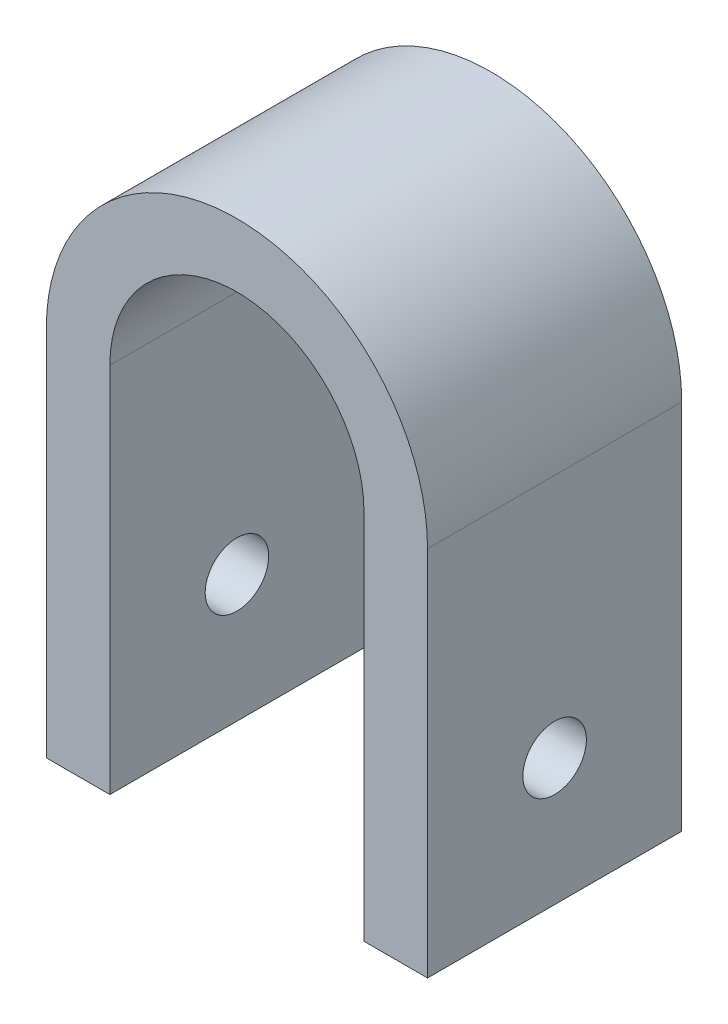
ISO-10303-21;
HEADER;
FILE_DESCRIPTION(('STEP AP214'),'2;1');
FILE_NAME('part.step','',(''),(''),'','','');
FILE_SCHEMA(('AUTOMOTIVE_DESIGN { 1 0 10303 214 1 1 1 1 }'));
ENDSEC;
DATA;
#1=APPLICATION_CONTEXT('core data for automotive mechanical design processes');
#2=APPLICATION_PROTOCOL_DEFINITION('international standard','automotive_design',2000,#1);
#3=PRODUCT_CONTEXT('',#1,'mechanical');
#4=PRODUCT('Part','Part','',(#3));
#5=PRODUCT_RELATED_PRODUCT_CATEGORY('part','',(#4));
#6=PRODUCT_DEFINITION_FORMATION('','',#4);
#7=PRODUCT_DEFINITION_CONTEXT('part definition',#1,'design');
#8=PRODUCT_DEFINITION('design','',#6,#7);
#9=PRODUCT_DEFINITION_SHAPE('','',#8);
#10=(LENGTH_UNIT() NAMED_UNIT(*) SI_UNIT(.MILLI.,.METRE.));
#11=(NAMED_UNIT(*) PLANE_ANGLE_UNIT() SI_UNIT($,.RADIAN.));
#12=(NAMED_UNIT(*) SI_UNIT($,.STERADIAN.) SOLID_ANGLE_UNIT());
#13=UNCERTAINTY_MEASURE_WITH_UNIT(LENGTH_MEASURE(1.E-05),#10,'distance_accuracy_value','');
#14=(GEOMETRIC_REPRESENTATION_CONTEXT(3) GLOBAL_UNCERTAINTY_ASSIGNED_CONTEXT((#13)) GLOBAL_UNIT_ASSIGNED_CONTEXT((#10,
#11,#12)) REPRESENTATION_CONTEXT('',''));
#15=CARTESIAN_POINT('',(0.,0.,0.));
#16=DIRECTION('',(0.,0.,1.));
#17=DIRECTION('',(1.,0.,0.));
#18=AXIS2_PLACEMENT_3D('',#15,#16,#17);
#19=CARTESIAN_POINT('',(0.,0.,8.));
#20=DIRECTION('',(0.,0.,-1.));
#21=DIRECTION('',(-1.,0.,0.));
#22=AXIS2_PLACEMENT_3D('',#19,#20,#21);
#23=CYLINDRICAL_SURFACE('',#22,4.);
#24=CARTESIAN_POINT('',(0.,0.,0.));
#25=DIRECTION('',(0.,0.,-1.));
#26=DIRECTION('',(1.,0.,0.));
#27=AXIS2_PLACEMENT_3D('',#24,#25,#26);
#28=CIRCLE('',#27,4.);
#29=CARTESIAN_POINT('',(-4.,0.,0.));
#30=VERTEX_POINT('',#29);
#31=CARTESIAN_POINT('',(4.,0.,0.));
#32=VERTEX_POINT('',#31);
#33=EDGE_CURVE('E142',#30,#32,#28,.T.);
#34=ORIENTED_EDGE('',*,*,#33,.T.);
#35=DIRECTION('',(0.,0.,-1.));
#36=VECTOR('',#35,1.);
#37=CARTESIAN_POINT('',(4.,0.,8.));
#38=LINE('',#37,#36);
#39=CARTESIAN_POINT('',(4.,0.,8.));
#40=VERTEX_POINT('',#39);
#41=EDGE_CURVE('E13',#40,#32,#38,.T.);
#42=ORIENTED_EDGE('',*,*,#41,.F.);
#43=CARTESIAN_POINT('',(0.,0.,8.));
#44=DIRECTION('',(0.,0.,-1.));
#45=DIRECTION('',(1.,0.,0.));
#46=AXIS2_PLACEMENT_3D('',#43,#44,#45);
#47=CIRCLE('',#46,4.);
#48=CARTESIAN_POINT('',(-4.,0.,8.));
#49=VERTEX_POINT('',#48);
#50=EDGE_CURVE('E157',#49,#40,#47,.T.);
#51=ORIENTED_EDGE('',*,*,#50,.F.);
#52=DIRECTION('',(0.,0.,-1.));
#53=VECTOR('',#52,1.);
#54=CARTESIAN_POINT('',(-4.,0.,8.));
#55=LINE('',#54,#53);
#56=EDGE_CURVE('E138',#49,#30,#55,.T.);
#57=ORIENTED_EDGE('',*,*,#56,.T.);
#58=EDGE_LOOP('',(#34,#42,#51,#57));
#59=FACE_BOUND('',#58,.T.);
#60=ADVANCED_FACE('F45',(#59),#23,.F.);
#61=CARTESIAN_POINT('',(4.,0.,8.));
#62=DIRECTION('',(1.,-5.94859942086409E-11,0.));
#63=DIRECTION('',(5.94859942086409E-11,1.,0.));
#64=AXIS2_PLACEMENT_3D('',#61,#62,#63);
#65=PLANE('',#64);
#66=CARTESIAN_POINT('',(3.99999999954187,-7.7015254759383,4.));
#67=DIRECTION('',(1.,-5.94859942086409E-11,0.));
#68=DIRECTION('',(5.94859942086409E-11,1.,0.));
#69=AXIS2_PLACEMENT_3D('',#66,#67,#68);
#70=CIRCLE('',#69,1.);
#71=CARTESIAN_POINT('',(3.99999999954187,-7.7015254759383,5.));
#72=VERTEX_POINT('',#71);
#73=EDGE_CURVE('E146',#72,#72,#70,.T.);
#74=ORIENTED_EDGE('',*,*,#73,.T.);
#75=EDGE_LOOP('',(#74));
#76=FACE_BOUND('',#75,.T.);
#77=DIRECTION('',(-5.94859942086409E-11,-1.,0.));
#78=VECTOR('',#77,1.);
#79=CARTESIAN_POINT('',(4.,0.,0.));
#80=LINE('',#79,#78);
#81=CARTESIAN_POINT('',(3.99999999930393,-11.7015254759383,0.));
#82=VERTEX_POINT('',#81);
#83=EDGE_CURVE('E145',#32,#82,#80,.T.);
#84=ORIENTED_EDGE('',*,*,#83,.T.);
#85=DIRECTION('',(0.,0.,-1.));
#86=VECTOR('',#85,1.);
#87=CARTESIAN_POINT('',(3.99999999930393,-11.7015254759383,8.));
#88=LINE('',#87,#86);
#89=CARTESIAN_POINT('',(3.99999999930393,-11.7015254759383,8.));
#90=VERTEX_POINT('',#89);
#91=EDGE_CURVE('E54',#90,#82,#88,.T.);
#92=ORIENTED_EDGE('',*,*,#91,.F.);
#93=DIRECTION('',(-5.94859942086409E-11,-1.,0.));
#94=VECTOR('',#93,1.);
#95=CARTESIAN_POINT('',(4.,0.,8.));
#96=LINE('',#95,#94);
#97=EDGE_CURVE('E105',#40,#90,#96,.T.);
#98=ORIENTED_EDGE('',*,*,#97,.F.);
#99=ORIENTED_EDGE('',*,*,#41,.T.);
#100=EDGE_LOOP('',(#84,#92,#98,#99));
#101=FACE_BOUND('',#100,.T.);
#102=ADVANCED_FACE('F218',(#76,#101),#65,.F.);
#103=CARTESIAN_POINT('',(6.,-11.7015254759383,8.));
#104=DIRECTION('',(0.,1.,0.));
#105=DIRECTION('',(0.,0.,1.));
#106=AXIS2_PLACEMENT_3D('',#103,#104,#105);
#107=PLANE('',#106);
#108=DIRECTION('',(1.,0.,0.));
#109=VECTOR('',#108,1.);
#110=CARTESIAN_POINT('',(6.,-11.7015254759383,0.));
#111=LINE('',#110,#109);
#112=CARTESIAN_POINT('',(6.,-11.7015254759383,0.));
#113=VERTEX_POINT('',#112);
#114=EDGE_CURVE('E148',#82,#113,#111,.T.);
#115=ORIENTED_EDGE('',*,*,#114,.T.);
#116=DIRECTION('',(0.,0.,-1.));
#117=VECTOR('',#116,1.);
#118=CARTESIAN_POINT('',(6.,-11.7015254759383,8.));
#119=LINE('',#118,#117);
#120=CARTESIAN_POINT('',(6.,-11.7015254759383,8.));
#121=VERTEX_POINT('',#120);
#122=EDGE_CURVE('E164',#121,#113,#119,.T.);
#123=ORIENTED_EDGE('',*,*,#122,.F.);
#124=DIRECTION('',(1.,0.,0.));
#125=VECTOR('',#124,1.);
#126=CARTESIAN_POINT('',(6.,-11.7015254759383,8.));
#127=LINE('',#126,#125);
#128=EDGE_CURVE('E173',#90,#121,#127,.T.);
#129=ORIENTED_EDGE('',*,*,#128,.F.);
#130=ORIENTED_EDGE('',*,*,#91,.T.);
#131=EDGE_LOOP('',(#115,#123,#129,#130));
#132=FACE_BOUND('',#131,.T.);
#133=ADVANCED_FACE('F171',(#132),#107,.F.);
#134=CARTESIAN_POINT('',(6.,0.,8.));
#135=DIRECTION('',(-1.,0.,0.));
#136=DIRECTION('',(0.,0.,1.));
#137=AXIS2_PLACEMENT_3D('',#134,#135,#136);
#138=PLANE('',#137);
#139=CARTESIAN_POINT('',(6.,-7.7015254759383,4.));
#140=DIRECTION('',(-1.,0.,0.));
#141=DIRECTION('',(0.,0.,1.));
#142=AXIS2_PLACEMENT_3D('',#139,#140,#141);
#143=CIRCLE('',#142,1.);
#144=CARTESIAN_POINT('',(6.,-7.7015254759383,5.));
#145=VERTEX_POINT('',#144);
#146=EDGE_CURVE('E196',#145,#145,#143,.T.);
#147=ORIENTED_EDGE('',*,*,#146,.T.);
#148=EDGE_LOOP('',(#147));
#149=FACE_BOUND('',#148,.T.);
#150=DIRECTION('',(0.,1.,0.));
#151=VECTOR('',#150,1.);
#152=CARTESIAN_POINT('',(6.,0.,0.));
#153=LINE('',#152,#151);
#154=CARTESIAN_POINT('',(6.,0.,0.));
#155=VERTEX_POINT('',#154);
#156=EDGE_CURVE('E150',#113,#155,#153,.T.);
#157=ORIENTED_EDGE('',*,*,#156,.T.);
#158=DIRECTION('',(0.,0.,-1.));
#159=VECTOR('',#158,1.);
#160=CARTESIAN_POINT('',(6.,0.,8.));
#161=LINE('',#160,#159);
#162=CARTESIAN_POINT('',(6.,0.,8.));
#163=VERTEX_POINT('',#162);
#164=EDGE_CURVE('E161',#163,#155,#161,.T.);
#165=ORIENTED_EDGE('',*,*,#164,.F.);
#166=DIRECTION('',(0.,1.,0.));
#167=VECTOR('',#166,1.);
#168=CARTESIAN_POINT('',(6.,0.,8.));
#169=LINE('',#168,#167);
#170=EDGE_CURVE('E185',#121,#163,#169,.T.);
#171=ORIENTED_EDGE('',*,*,#170,.F.);
#172=ORIENTED_EDGE('',*,*,#122,.T.);
#173=EDGE_LOOP('',(#157,#165,#171,#172));
#174=FACE_BOUND('',#173,.T.);
#175=ADVANCED_FACE('F181',(#149,#174),#138,.F.);
#176=CARTESIAN_POINT('',(0.,0.,8.));
#177=DIRECTION('',(0.,0.,-1.));
#178=DIRECTION('',(-1.,0.,0.));
#179=AXIS2_PLACEMENT_3D('',#176,#177,#178);
#180=CYLINDRICAL_SURFACE('',#179,6.);
#181=CARTESIAN_POINT('',(0.,0.,0.));
#182=DIRECTION('',(0.,0.,1.));
#183=DIRECTION('',(1.,0.,0.));
#184=AXIS2_PLACEMENT_3D('',#181,#182,#183);
#185=CIRCLE('',#184,6.);
#186=CARTESIAN_POINT('',(-6.,0.,0.));
#187=VERTEX_POINT('',#186);
#188=EDGE_CURVE('E152',#155,#187,#185,.T.);
#189=ORIENTED_EDGE('',*,*,#188,.T.);
#190=DIRECTION('',(0.,0.,-1.));
#191=VECTOR('',#190,1.);
#192=CARTESIAN_POINT('',(-6.,0.,8.));
#193=LINE('',#192,#191);
#194=CARTESIAN_POINT('',(-6.,0.,8.));
#195=VERTEX_POINT('',#194);
#196=EDGE_CURVE('E133',#195,#187,#193,.T.);
#197=ORIENTED_EDGE('',*,*,#196,.F.);
#198=CARTESIAN_POINT('',(0.,0.,8.));
#199=DIRECTION('',(0.,0.,1.));
#200=DIRECTION('',(1.,0.,0.));
#201=AXIS2_PLACEMENT_3D('',#198,#199,#200);
#202=CIRCLE('',#201,6.);
#203=EDGE_CURVE('E124',#163,#195,#202,.T.);
#204=ORIENTED_EDGE('',*,*,#203,.F.);
#205=ORIENTED_EDGE('',*,*,#164,.T.);
#206=EDGE_LOOP('',(#189,#197,#204,#205));
#207=FACE_BOUND('',#206,.T.);
#208=ADVANCED_FACE('F184',(#207),#180,.T.);
#209=CARTESIAN_POINT('',(-6.,0.,8.));
#210=DIRECTION('',(1.,0.,0.));
#211=DIRECTION('',(0.,0.,-1.));
#212=AXIS2_PLACEMENT_3D('',#209,#210,#211);
#213=PLANE('',#212);
#214=CARTESIAN_POINT('',(-6.,-7.7015254759383,4.));
#215=DIRECTION('',(-1.,0.,0.));
#216=DIRECTION('',(0.,0.,1.));
#217=AXIS2_PLACEMENT_3D('',#214,#215,#216);
#218=CIRCLE('',#217,1.);
#219=CARTESIAN_POINT('',(-6.,-7.7015254759383,5.));
#220=VERTEX_POINT('',#219);
#221=EDGE_CURVE('E193',#220,#220,#218,.T.);
#222=ORIENTED_EDGE('',*,*,#221,.F.);
#223=EDGE_LOOP('',(#222));
#224=FACE_BOUND('',#223,.T.);
#225=DIRECTION('',(0.,-1.,0.));
#226=VECTOR('',#225,1.);
#227=CARTESIAN_POINT('',(-6.,0.,0.));
#228=LINE('',#227,#226);
#229=CARTESIAN_POINT('',(-6.,-11.7015254759383,0.));
#230=VERTEX_POINT('',#229);
#231=EDGE_CURVE('E132',#187,#230,#228,.T.);
#232=ORIENTED_EDGE('',*,*,#231,.T.);
#233=DIRECTION('',(0.,0.,-1.));
#234=VECTOR('',#233,1.);
#235=CARTESIAN_POINT('',(-6.,-11.7015254759383,8.));
#236=LINE('',#235,#234);
#237=CARTESIAN_POINT('',(-6.,-11.7015254759383,8.));
#238=VERTEX_POINT('',#237);
#239=EDGE_CURVE('E129',#238,#230,#236,.T.);
#240=ORIENTED_EDGE('',*,*,#239,.F.);
#241=DIRECTION('',(0.,-1.,0.));
#242=VECTOR('',#241,1.);
#243=CARTESIAN_POINT('',(-6.,0.,8.));
#244=LINE('',#243,#242);
#245=EDGE_CURVE('E118',#195,#238,#244,.T.);
#246=ORIENTED_EDGE('',*,*,#245,.F.);
#247=ORIENTED_EDGE('',*,*,#196,.T.);
#248=EDGE_LOOP('',(#232,#240,#246,#247));
#249=FACE_BOUND('',#248,.T.);
#250=ADVANCED_FACE('F130',(#224,#249),#213,.F.);
#251=CARTESIAN_POINT('',(-6.,-11.7015254759383,8.));
#252=DIRECTION('',(0.,1.,0.));
#253=DIRECTION('',(0.,0.,1.));
#254=AXIS2_PLACEMENT_3D('',#251,#252,#253);
#255=PLANE('',#254);
#256=DIRECTION('',(1.,0.,0.));
#257=VECTOR('',#256,1.);
#258=CARTESIAN_POINT('',(-6.,-11.7015254759383,0.));
#259=LINE('',#258,#257);
#260=CARTESIAN_POINT('',(-4.00000000069605,-11.7015254759383,0.));
#261=VERTEX_POINT('',#260);
#262=EDGE_CURVE('E91',#230,#261,#259,.T.);
#263=ORIENTED_EDGE('',*,*,#262,.T.);
#264=DIRECTION('',(0.,0.,-1.));
#265=VECTOR('',#264,1.);
#266=CARTESIAN_POINT('',(-4.00000000069605,-11.7015254759383,8.));
#267=LINE('',#266,#265);
#268=CARTESIAN_POINT('',(-4.00000000069605,-11.7015254759383,8.));
#269=VERTEX_POINT('',#268);
#270=EDGE_CURVE('E134',#269,#261,#267,.T.);
#271=ORIENTED_EDGE('',*,*,#270,.F.);
#272=DIRECTION('',(1.,0.,0.));
#273=VECTOR('',#272,1.);
#274=CARTESIAN_POINT('',(-6.,-11.7015254759383,8.));
#275=LINE('',#274,#273);
#276=EDGE_CURVE('E122',#238,#269,#275,.T.);
#277=ORIENTED_EDGE('',*,*,#276,.F.);
#278=ORIENTED_EDGE('',*,*,#239,.T.);
#279=EDGE_LOOP('',(#263,#271,#277,#278));
#280=FACE_BOUND('',#279,.T.);
#281=ADVANCED_FACE('F136',(#280),#255,.F.);
#282=CARTESIAN_POINT('',(-4.,0.,8.));
#283=DIRECTION('',(-1.,5.94841411132052E-11,0.));
#284=DIRECTION('',(-5.94841411132052E-11,-1.,0.));
#285=AXIS2_PLACEMENT_3D('',#282,#283,#284);
#286=PLANE('',#285);
#287=CARTESIAN_POINT('',(-4.00000000045811,-7.7015254759383,4.));
#288=DIRECTION('',(-1.,5.94841411132052E-11,0.));
#289=DIRECTION('',(-5.94841411132052E-11,-1.,0.));
#290=AXIS2_PLACEMENT_3D('',#287,#288,#289);
#291=CIRCLE('',#290,1.);
#292=CARTESIAN_POINT('',(-4.00000000045811,-7.7015254759383,5.));
#293=VERTEX_POINT('',#292);
#294=EDGE_CURVE('E48',#293,#293,#291,.T.);
#295=ORIENTED_EDGE('',*,*,#294,.T.);
#296=EDGE_LOOP('',(#295));
#297=FACE_BOUND('',#296,.T.);
#298=DIRECTION('',(5.94841411132052E-11,1.,0.));
#299=VECTOR('',#298,1.);
#300=CARTESIAN_POINT('',(-4.,0.,0.));
#301=LINE('',#300,#299);
#302=EDGE_CURVE('E97',#261,#30,#301,.T.);
#303=ORIENTED_EDGE('',*,*,#302,.T.);
#304=ORIENTED_EDGE('',*,*,#56,.F.);
#305=DIRECTION('',(5.94841411132052E-11,1.,0.));
#306=VECTOR('',#305,1.);
#307=CARTESIAN_POINT('',(-4.,0.,8.));
#308=LINE('',#307,#306);
#309=EDGE_CURVE('E62',#269,#49,#308,.T.);
#310=ORIENTED_EDGE('',*,*,#309,.F.);
#311=ORIENTED_EDGE('',*,*,#270,.T.);
#312=EDGE_LOOP('',(#303,#304,#310,#311));
#313=FACE_BOUND('',#312,.T.);
#314=ADVANCED_FACE('F203',(#297,#313),#286,.F.);
#315=CARTESIAN_POINT('',(0.,0.,8.));
#316=DIRECTION('',(0.,0.,1.));
#317=DIRECTION('',(1.,0.,0.));
#318=AXIS2_PLACEMENT_3D('',#315,#316,#317);
#319=PLANE('',#318);
#320=ORIENTED_EDGE('',*,*,#50,.T.);
#321=ORIENTED_EDGE('',*,*,#97,.T.);
#322=ORIENTED_EDGE('',*,*,#128,.T.);
#323=ORIENTED_EDGE('',*,*,#170,.T.);
#324=ORIENTED_EDGE('',*,*,#203,.T.);
#325=ORIENTED_EDGE('',*,*,#245,.T.);
#326=ORIENTED_EDGE('',*,*,#276,.T.);
#327=ORIENTED_EDGE('',*,*,#309,.T.);
#328=EDGE_LOOP('',(#320,#321,#322,#323,#324,#325,#326,#327));
#329=FACE_BOUND('',#328,.T.);
#330=ADVANCED_FACE('F120',(#329),#319,.T.);
#331=CARTESIAN_POINT('',(0.,0.,0.));
#332=DIRECTION('',(0.,0.,1.));
#333=DIRECTION('',(1.,0.,0.));
#334=AXIS2_PLACEMENT_3D('',#331,#332,#333);
#335=PLANE('',#334);
#336=ORIENTED_EDGE('',*,*,#33,.F.);
#337=ORIENTED_EDGE('',*,*,#302,.F.);
#338=ORIENTED_EDGE('',*,*,#262,.F.);
#339=ORIENTED_EDGE('',*,*,#231,.F.);
#340=ORIENTED_EDGE('',*,*,#188,.F.);
#341=ORIENTED_EDGE('',*,*,#156,.F.);
#342=ORIENTED_EDGE('',*,*,#114,.F.);
#343=ORIENTED_EDGE('',*,*,#83,.F.);
#344=EDGE_LOOP('',(#336,#337,#338,#339,#340,#341,#342,#343));
#345=FACE_BOUND('',#344,.T.);
#346=ADVANCED_FACE('F177',(#345),#335,.F.);
#347=CARTESIAN_POINT('',(6.,-7.7015254759383,4.));
#348=DIRECTION('',(-1.,0.,0.));
#349=DIRECTION('',(0.,0.,1.));
#350=AXIS2_PLACEMENT_3D('',#347,#348,#349);
#351=CYLINDRICAL_SURFACE('',#350,1.);
#352=CARTESIAN_POINT('',(-6.,-7.7015254759383,5.));
#353=CARTESIAN_POINT('',(-5.97916666667144,-7.7015254759383,5.));
#354=CARTESIAN_POINT('',(-5.95833333334288,-7.7015254759383,5.));
#355=CARTESIAN_POINT('',(-5.91666666668576,-7.7015254759383,5.));
#356=CARTESIAN_POINT('',(-5.89583333335719,-7.7015254759383,5.));
#357=CARTESIAN_POINT('',(-5.85416666670007,-7.7015254759383,5.));
#358=CARTESIAN_POINT('',(-5.83333333337151,-7.7015254759383,5.));
#359=CARTESIAN_POINT('',(-5.79166666671439,-7.7015254759383,5.));
#360=CARTESIAN_POINT('',(-5.77083333338583,-7.7015254759383,5.));
#361=CARTESIAN_POINT('',(-5.7291666667287,-7.7015254759383,5.));
#362=CARTESIAN_POINT('',(-5.70833333340014,-7.7015254759383,5.));
#363=CARTESIAN_POINT('',(-5.66666666674302,-7.7015254759383,5.));
#364=CARTESIAN_POINT('',(-5.64583333341446,-7.7015254759383,5.));
#365=CARTESIAN_POINT('',(-5.60416666675734,-7.7015254759383,5.));
#366=CARTESIAN_POINT('',(-5.58333333342877,-7.7015254759383,5.));
#367=CARTESIAN_POINT('',(-5.54166666677165,-7.7015254759383,5.));
#368=CARTESIAN_POINT('',(-5.52083333344309,-7.7015254759383,5.));
#369=CARTESIAN_POINT('',(-5.47916666678597,-7.7015254759383,5.));
#370=CARTESIAN_POINT('',(-5.45833333345741,-7.7015254759383,5.));
#371=CARTESIAN_POINT('',(-5.41666666680028,-7.7015254759383,5.));
#372=CARTESIAN_POINT('',(-5.39583333347172,-7.7015254759383,5.));
#373=CARTESIAN_POINT('',(-5.3541666668146,-7.7015254759383,5.));
#374=CARTESIAN_POINT('',(-5.33333333348604,-7.7015254759383,5.));
#375=CARTESIAN_POINT('',(-5.29166666682892,-7.7015254759383,5.));
#376=CARTESIAN_POINT('',(-5.27083333350035,-7.7015254759383,5.));
#377=CARTESIAN_POINT('',(-5.22916666684323,-7.7015254759383,5.));
#378=CARTESIAN_POINT('',(-5.20833333351467,-7.7015254759383,5.));
#379=CARTESIAN_POINT('',(-5.16666666685755,-7.7015254759383,5.));
#380=CARTESIAN_POINT('',(-5.14583333352899,-7.7015254759383,5.));
#381=CARTESIAN_POINT('',(-5.10416666687186,-7.7015254759383,5.));
#382=CARTESIAN_POINT('',(-5.0833333335433,-7.7015254759383,5.));
#383=CARTESIAN_POINT('',(-5.04166666688618,-7.7015254759383,5.));
#384=CARTESIAN_POINT('',(-5.02083333355762,-7.7015254759383,5.));
#385=CARTESIAN_POINT('',(-4.9791666669005,-7.7015254759383,5.));
#386=CARTESIAN_POINT('',(-4.95833333357193,-7.7015254759383,5.));
#387=CARTESIAN_POINT('',(-4.91666666691481,-7.7015254759383,5.));
#388=CARTESIAN_POINT('',(-4.89583333358625,-7.7015254759383,5.));
#389=CARTESIAN_POINT('',(-4.85416666692913,-7.7015254759383,5.));
#390=CARTESIAN_POINT('',(-4.83333333360057,-7.7015254759383,5.));
#391=CARTESIAN_POINT('',(-4.79166666694344,-7.7015254759383,5.));
#392=CARTESIAN_POINT('',(-4.77083333361488,-7.7015254759383,5.));
#393=CARTESIAN_POINT('',(-4.72916666695776,-7.7015254759383,5.));
#394=CARTESIAN_POINT('',(-4.7083333336292,-7.7015254759383,5.));
#395=CARTESIAN_POINT('',(-4.66666666697208,-7.7015254759383,5.));
#396=CARTESIAN_POINT('',(-4.64583333364351,-7.7015254759383,5.));
#397=CARTESIAN_POINT('',(-4.60416666698639,-7.7015254759383,5.));
#398=CARTESIAN_POINT('',(-4.58333333365783,-7.7015254759383,5.));
#399=CARTESIAN_POINT('',(-4.54166666700071,-7.7015254759383,5.));
#400=CARTESIAN_POINT('',(-4.52083333367215,-7.7015254759383,5.));
#401=CARTESIAN_POINT('',(-4.47916666701502,-7.7015254759383,5.));
#402=CARTESIAN_POINT('',(-4.45833333368646,-7.7015254759383,5.));
#403=CARTESIAN_POINT('',(-4.41666666702934,-7.7015254759383,5.));
#404=CARTESIAN_POINT('',(-4.39583333370078,-7.7015254759383,5.));
#405=CARTESIAN_POINT('',(-4.35416666704365,-7.7015254759383,5.));
#406=CARTESIAN_POINT('',(-4.33333333371509,-7.7015254759383,5.));
#407=CARTESIAN_POINT('',(-4.29166666705797,-7.7015254759383,5.));
#408=CARTESIAN_POINT('',(-4.27083333372941,-7.7015254759383,5.));
#409=CARTESIAN_POINT('',(-4.22916666707229,-7.7015254759383,5.));
#410=CARTESIAN_POINT('',(-4.20833333374373,-7.7015254759383,5.));
#411=CARTESIAN_POINT('',(-4.1666666670866,-7.7015254759383,5.));
#412=CARTESIAN_POINT('',(-4.14583333375804,-7.7015254759383,5.));
#413=CARTESIAN_POINT('',(-4.10416666710092,-7.7015254759383,5.));
#414=CARTESIAN_POINT('',(-4.08333333377236,-7.7015254759383,5.));
#415=CARTESIAN_POINT('',(-4.04166666711523,-7.7015254759383,5.));
#416=CARTESIAN_POINT('',(-4.02083333378667,-7.7015254759383,5.));
#417=CARTESIAN_POINT('',(-4.00000000045811,-7.7015254759383,5.));
#418=B_SPLINE_CURVE_WITH_KNOTS('',3,(#352,#353,#354,#355,#356,#357,#358,#359,#360,#361,#362,
#363,#364,#365,#366,#367,#368,#369,#370,#371,#372,#373,#374,#375,#376,#377,#378,#379,#380,#381,
#382,#383,#384,#385,#386,#387,#388,#389,#390,#391,#392,#393,#394,#395,#396,#397,#398,#399,#400,
#401,#402,#403,#404,#405,#406,#407,#408,#409,#410,#411,#412,#413,#414,#415,#416,#417),
.UNSPECIFIED.,.F.,.F.,(4,2,2,2,2,2,2,2,2,2,2,2,2,2,2,2,2,2,2,2,2,2,2,2,2,2,2,2,2,2,2,2,4),(0.,
0.0624999999856834,0.124999999971369,0.187499999957052,0.249999999942737,0.31249999992842,
0.374999999914104,0.437499999899789,0.499999999885472,0.562499999871156,0.624999999856841,
0.687499999842524,0.749999999828208,0.812499999813893,0.874999999799576,0.937499999785261,
0.999999999770945,1.06249999975663,1.12499999974231,1.187499999728,1.24999999971368,
1.31249999969936,1.37499999968505,1.43749999967073,1.49999999965642,1.5624999996421,
1.62499999962779,1.68749999961347,1.74999999959915,1.81249999958484,1.87499999957052,
1.93749999955621,1.99999999954189),.UNSPECIFIED.);
#419=EDGE_CURVE('BSEAM205',#220,#293,#418,.T.);
#420=ORIENTED_EDGE('',*,*,#221,.T.);
#421=ORIENTED_EDGE('',*,*,#294,.F.);
#422=ORIENTED_EDGE('',*,*,#419,.T.);
#423=ORIENTED_EDGE('',*,*,#419,.F.);
#424=EDGE_LOOP('',(#420,#422,#421,#423));
#425=FACE_BOUND('',#424,.T.);
#426=ADVANCED_FACE('F205',(#425),#351,.F.);
#427=CARTESIAN_POINT('',(6.,-7.7015254759383,5.));
#428=CARTESIAN_POINT('',(5.9791666666619,-7.7015254759383,5.));
#429=CARTESIAN_POINT('',(5.95833333332379,-7.7015254759383,5.));
#430=CARTESIAN_POINT('',(5.91666666664758,-7.7015254759383,5.));
#431=CARTESIAN_POINT('',(5.89583333330947,-7.7015254759383,5.));
#432=CARTESIAN_POINT('',(5.85416666663326,-7.7015254759383,5.));
#433=CARTESIAN_POINT('',(5.83333333329516,-7.7015254759383,5.));
#434=CARTESIAN_POINT('',(5.79166666661895,-7.7015254759383,5.));
#435=CARTESIAN_POINT('',(5.77083333328084,-7.7015254759383,5.));
#436=CARTESIAN_POINT('',(5.72916666660463,-7.7015254759383,5.));
#437=CARTESIAN_POINT('',(5.70833333326652,-7.7015254759383,5.));
#438=CARTESIAN_POINT('',(5.66666666659031,-7.7015254759383,5.));
#439=CARTESIAN_POINT('',(5.64583333325221,-7.7015254759383,5.));
#440=CARTESIAN_POINT('',(5.604166666576,-7.7015254759383,5.));
#441=CARTESIAN_POINT('',(5.58333333323789,-7.7015254759383,5.));
#442=CARTESIAN_POINT('',(5.54166666656168,-7.7015254759383,5.));
#443=CARTESIAN_POINT('',(5.52083333322357,-7.7015254759383,5.));
#444=CARTESIAN_POINT('',(5.47916666654736,-7.7015254759383,5.));
#445=CARTESIAN_POINT('',(5.45833333320926,-7.7015254759383,5.));
#446=CARTESIAN_POINT('',(5.41666666653305,-7.7015254759383,5.));
#447=CARTESIAN_POINT('',(5.39583333319494,-7.7015254759383,5.));
#448=CARTESIAN_POINT('',(5.35416666651873,-7.7015254759383,5.));
#449=CARTESIAN_POINT('',(5.33333333318062,-7.7015254759383,5.));
#450=CARTESIAN_POINT('',(5.29166666650441,-7.7015254759383,5.));
#451=CARTESIAN_POINT('',(5.27083333316631,-7.7015254759383,5.));
#452=CARTESIAN_POINT('',(5.2291666664901,-7.7015254759383,5.));
#453=CARTESIAN_POINT('',(5.20833333315199,-7.7015254759383,5.));
#454=CARTESIAN_POINT('',(5.16666666647578,-7.7015254759383,5.));
#455=CARTESIAN_POINT('',(5.14583333313767,-7.7015254759383,5.));
#456=CARTESIAN_POINT('',(5.10416666646146,-7.7015254759383,5.));
#457=CARTESIAN_POINT('',(5.08333333312336,-7.7015254759383,5.));
#458=CARTESIAN_POINT('',(5.04166666644715,-7.7015254759383,5.));
#459=CARTESIAN_POINT('',(5.02083333310904,-7.7015254759383,5.));
#460=CARTESIAN_POINT('',(4.97916666643283,-7.7015254759383,5.));
#461=CARTESIAN_POINT('',(4.95833333309472,-7.7015254759383,5.));
#462=CARTESIAN_POINT('',(4.91666666641851,-7.7015254759383,5.));
#463=CARTESIAN_POINT('',(4.89583333308041,-7.7015254759383,5.));
#464=CARTESIAN_POINT('',(4.8541666664042,-7.7015254759383,5.));
#465=CARTESIAN_POINT('',(4.83333333306609,-7.7015254759383,5.));
#466=CARTESIAN_POINT('',(4.79166666638988,-7.7015254759383,5.));
#467=CARTESIAN_POINT('',(4.77083333305178,-7.7015254759383,5.));
#468=CARTESIAN_POINT('',(4.72916666637556,-7.7015254759383,5.));
#469=CARTESIAN_POINT('',(4.70833333303746,-7.7015254759383,5.));
#470=CARTESIAN_POINT('',(4.66666666636125,-7.7015254759383,5.));
#471=CARTESIAN_POINT('',(4.64583333302314,-7.7015254759383,5.));
#472=CARTESIAN_POINT('',(4.60416666634693,-7.7015254759383,5.));
#473=CARTESIAN_POINT('',(4.58333333300882,-7.7015254759383,5.));
#474=CARTESIAN_POINT('',(4.54166666633261,-7.7015254759383,5.));
#475=CARTESIAN_POINT('',(4.52083333299451,-7.7015254759383,5.));
#476=CARTESIAN_POINT('',(4.4791666663183,-7.7015254759383,5.));
#477=CARTESIAN_POINT('',(4.45833333298019,-7.7015254759383,5.));
#478=CARTESIAN_POINT('',(4.41666666630398,-7.7015254759383,5.));
#479=CARTESIAN_POINT('',(4.39583333296587,-7.7015254759383,5.));
#480=CARTESIAN_POINT('',(4.35416666628966,-7.7015254759383,5.));
#481=CARTESIAN_POINT('',(4.33333333295156,-7.7015254759383,5.));
#482=CARTESIAN_POINT('',(4.29166666627535,-7.7015254759383,5.));
#483=CARTESIAN_POINT('',(4.27083333293724,-7.7015254759383,5.));
#484=CARTESIAN_POINT('',(4.22916666626103,-7.7015254759383,5.));
#485=CARTESIAN_POINT('',(4.20833333292293,-7.7015254759383,5.));
#486=CARTESIAN_POINT('',(4.16666666624671,-7.7015254759383,5.));
#487=CARTESIAN_POINT('',(4.14583333290861,-7.7015254759383,5.));
#488=CARTESIAN_POINT('',(4.1041666662324,-7.7015254759383,5.));
#489=CARTESIAN_POINT('',(4.08333333289429,-7.7015254759383,5.));
#490=CARTESIAN_POINT('',(4.04166666621808,-7.7015254759383,5.));
#491=CARTESIAN_POINT('',(4.02083333287997,-7.7015254759383,5.));
#492=CARTESIAN_POINT('',(3.99999999954187,-7.7015254759383,5.));
#493=B_SPLINE_CURVE_WITH_KNOTS('',3,(#427,#428,#429,#430,#431,#432,#433,#434,#435,#436,#437,
#438,#439,#440,#441,#442,#443,#444,#445,#446,#447,#448,#449,#450,#451,#452,#453,#454,#455,#456,
#457,#458,#459,#460,#461,#462,#463,#464,#465,#466,#467,#468,#469,#470,#471,#472,#473,#474,#475,
#476,#477,#478,#479,#480,#481,#482,#483,#484,#485,#486,#487,#488,#489,#490,#491,#492),
.UNSPECIFIED.,.F.,.F.,(4,2,2,2,2,2,2,2,2,2,2,2,2,2,2,2,2,2,2,2,2,2,2,2,2,2,2,2,2,2,2,2,4),(0.,
0.0625000000143167,0.125000000028633,0.18750000004295,0.250000000057267,0.312500000071584,
0.3750000000859,0.437500000100217,0.500000000114534,0.56250000012885,0.625000000143166,
0.687500000157483,0.7500000001718,0.812500000186117,0.875000000200433,0.93750000021475,
1.00000000022907,1.06250000024338,1.1250000002577,1.18750000027202,1.25000000028633,
1.31250000030065,1.37500000031497,1.43750000032928,1.5000000003436,1.56250000035792,
1.62500000037223,1.68750000038655,1.75000000040087,1.81250000041518,1.8750000004295,
1.93750000044382,2.00000000045813),.UNSPECIFIED.);
#494=EDGE_CURVE('BSEAM207',#145,#72,#493,.T.);
#495=ORIENTED_EDGE('',*,*,#146,.F.);
#496=ORIENTED_EDGE('',*,*,#73,.F.);
#497=ORIENTED_EDGE('',*,*,#494,.T.);
#498=ORIENTED_EDGE('',*,*,#494,.F.);
#499=EDGE_LOOP('',(#495,#497,#496,#498));
#500=FACE_BOUND('',#499,.T.);
#501=ADVANCED_FACE('F207',(#500),#351,.F.);
#502=CLOSED_SHELL('',(#60,#102,#133,#175,#208,#250,#281,#314,#330,#346,#426,#501));
#503=MANIFOLD_SOLID_BREP('B2',#502);
#504=ADVANCED_BREP_SHAPE_REPRESENTATION('',(#18,#503),#14);
#505=SHAPE_DEFINITION_REPRESENTATION(#9,#504);
ENDSEC;
END-ISO-10303-21;
